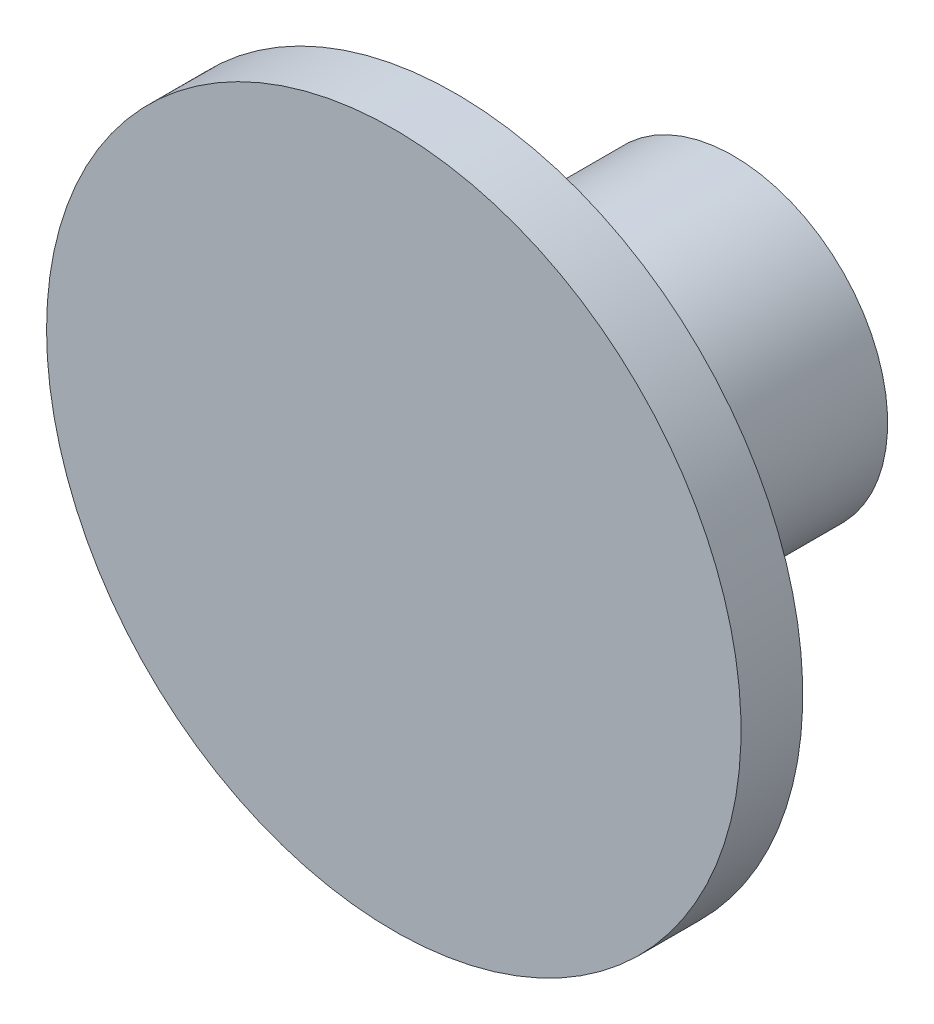
ISO-10303-21;
HEADER;
FILE_DESCRIPTION(('STEP AP214'),'2;1');
FILE_NAME('part.step','',(''),(''),'','','');
FILE_SCHEMA(('AUTOMOTIVE_DESIGN { 1 0 10303 214 1 1 1 1 }'));
ENDSEC;
DATA;
#1=APPLICATION_CONTEXT('core data for automotive mechanical design processes');
#2=APPLICATION_PROTOCOL_DEFINITION('international standard','automotive_design',2000,#1);
#3=PRODUCT_CONTEXT('',#1,'mechanical');
#4=PRODUCT('Part','Part','',(#3));
#5=PRODUCT_RELATED_PRODUCT_CATEGORY('part','',(#4));
#6=PRODUCT_DEFINITION_FORMATION('','',#4);
#7=PRODUCT_DEFINITION_CONTEXT('part definition',#1,'design');
#8=PRODUCT_DEFINITION('design','',#6,#7);
#9=PRODUCT_DEFINITION_SHAPE('','',#8);
#10=(LENGTH_UNIT() NAMED_UNIT(*) SI_UNIT(.MILLI.,.METRE.));
#11=(NAMED_UNIT(*) PLANE_ANGLE_UNIT() SI_UNIT($,.RADIAN.));
#12=(NAMED_UNIT(*) SI_UNIT($,.STERADIAN.) SOLID_ANGLE_UNIT());
#13=UNCERTAINTY_MEASURE_WITH_UNIT(LENGTH_MEASURE(1.E-05),#10,'distance_accuracy_value','');
#14=(GEOMETRIC_REPRESENTATION_CONTEXT(3) GLOBAL_UNCERTAINTY_ASSIGNED_CONTEXT((#13)) GLOBAL_UNIT_ASSIGNED_CONTEXT((#10,
#11,#12)) REPRESENTATION_CONTEXT('',''));
#15=CARTESIAN_POINT('',(0.,0.,0.));
#16=DIRECTION('',(0.,0.,1.));
#17=DIRECTION('',(1.,0.,0.));
#18=AXIS2_PLACEMENT_3D('',#15,#16,#17);
#19=CARTESIAN_POINT('',(0.,-10.05259329813,-31.5));
#20=DIRECTION('',(0.,0.,-1.));
#21=DIRECTION('',(-1.,0.,0.));
#22=AXIS2_PLACEMENT_3D('',#19,#20,#21);
#23=CYLINDRICAL_SURFACE('',#22,4.5);
#24=CARTESIAN_POINT('',(0.,-10.05259329813,-31.5));
#25=DIRECTION('',(0.,0.,-1.));
#26=DIRECTION('',(-1.,0.,0.));
#27=AXIS2_PLACEMENT_3D('',#24,#25,#26);
#28=CIRCLE('',#27,4.5);
#29=CARTESIAN_POINT('',(-4.5,-10.05259329813,-31.5));
#30=VERTEX_POINT('',#29);
#31=EDGE_CURVE('E10',#30,#30,#28,.T.);
#32=ORIENTED_EDGE('',*,*,#31,.T.);
#33=EDGE_LOOP('',(#32));
#34=FACE_BOUND('',#33,.T.);
#35=CARTESIAN_POINT('',(0.,-10.05259329813,-32.3));
#36=DIRECTION('',(0.,0.,-1.));
#37=DIRECTION('',(-1.,0.,0.));
#38=AXIS2_PLACEMENT_3D('',#35,#36,#37);
#39=CIRCLE('',#38,4.5);
#40=CARTESIAN_POINT('',(-4.5,-10.05259329813,-32.3));
#41=VERTEX_POINT('',#40);
#42=EDGE_CURVE('E45',#41,#41,#39,.T.);
#43=ORIENTED_EDGE('',*,*,#42,.F.);
#44=EDGE_LOOP('',(#43));
#45=FACE_BOUND('',#44,.T.);
#46=ADVANCED_FACE('F31',(#34,#45),#23,.T.);
#47=CARTESIAN_POINT('',(4.5,-10.05259329813,-31.5));
#48=DIRECTION('',(0.,0.,1.));
#49=DIRECTION('',(1.,0.,0.));
#50=AXIS2_PLACEMENT_3D('',#47,#48,#49);
#51=PLANE('',#50);
#52=ORIENTED_EDGE('',*,*,#31,.F.);
#53=EDGE_LOOP('',(#52));
#54=FACE_BOUND('',#53,.T.);
#55=ADVANCED_FACE('F55',(#54),#51,.T.);
#56=CARTESIAN_POINT('',(0.,-10.05259329813,-35.9));
#57=DIRECTION('',(0.,0.,-1.));
#58=DIRECTION('',(-1.,0.,0.));
#59=AXIS2_PLACEMENT_3D('',#56,#57,#58);
#60=PLANE('',#59);
#61=CARTESIAN_POINT('',(0.,-10.05259329813,-35.9));
#62=DIRECTION('',(0.,0.,-1.));
#63=DIRECTION('',(-1.,0.,0.));
#64=AXIS2_PLACEMENT_3D('',#61,#62,#63);
#65=CIRCLE('',#64,2.);
#66=CARTESIAN_POINT('',(-2.,-10.05259329813,-35.9));
#67=VERTEX_POINT('',#66);
#68=EDGE_CURVE('E37',#67,#67,#65,.T.);
#69=ORIENTED_EDGE('',*,*,#68,.T.);
#70=EDGE_LOOP('',(#69));
#71=FACE_BOUND('',#70,.T.);
#72=ADVANCED_FACE('F59',(#71),#60,.T.);
#73=CARTESIAN_POINT('',(0.,-10.05259329813,-31.5));
#74=DIRECTION('',(0.,0.,-1.));
#75=DIRECTION('',(-1.,0.,0.));
#76=AXIS2_PLACEMENT_3D('',#73,#74,#75);
#77=CYLINDRICAL_SURFACE('',#76,2.);
#78=CARTESIAN_POINT('',(0.,-10.05259329813,-32.3));
#79=DIRECTION('',(0.,0.,-1.));
#80=DIRECTION('',(-1.,0.,0.));
#81=AXIS2_PLACEMENT_3D('',#78,#79,#80);
#82=CIRCLE('',#81,2.);
#83=CARTESIAN_POINT('',(-2.,-10.05259329813,-32.3));
#84=VERTEX_POINT('',#83);
#85=EDGE_CURVE('E41',#84,#84,#82,.T.);
#86=ORIENTED_EDGE('',*,*,#85,.T.);
#87=EDGE_LOOP('',(#86));
#88=FACE_BOUND('',#87,.T.);
#89=ORIENTED_EDGE('',*,*,#68,.F.);
#90=EDGE_LOOP('',(#89));
#91=FACE_BOUND('',#90,.T.);
#92=ADVANCED_FACE('F64',(#88,#91),#77,.T.);
#93=CARTESIAN_POINT('',(2.,-10.05259329813,-32.3));
#94=DIRECTION('',(0.,0.,-1.));
#95=DIRECTION('',(-1.,0.,0.));
#96=AXIS2_PLACEMENT_3D('',#93,#94,#95);
#97=PLANE('',#96);
#98=ORIENTED_EDGE('',*,*,#42,.T.);
#99=EDGE_LOOP('',(#98));
#100=FACE_BOUND('',#99,.T.);
#101=ORIENTED_EDGE('',*,*,#85,.F.);
#102=EDGE_LOOP('',(#101));
#103=FACE_BOUND('',#102,.T.);
#104=ADVANCED_FACE('F51',(#100,#103),#97,.T.);
#105=CLOSED_SHELL('',(#46,#55,#72,#92,#104));
#106=MANIFOLD_SOLID_BREP('B2',#105);
#107=ADVANCED_BREP_SHAPE_REPRESENTATION('',(#18,#106),#14);
#108=SHAPE_DEFINITION_REPRESENTATION(#9,#107);
ENDSEC;
END-ISO-10303-21;
